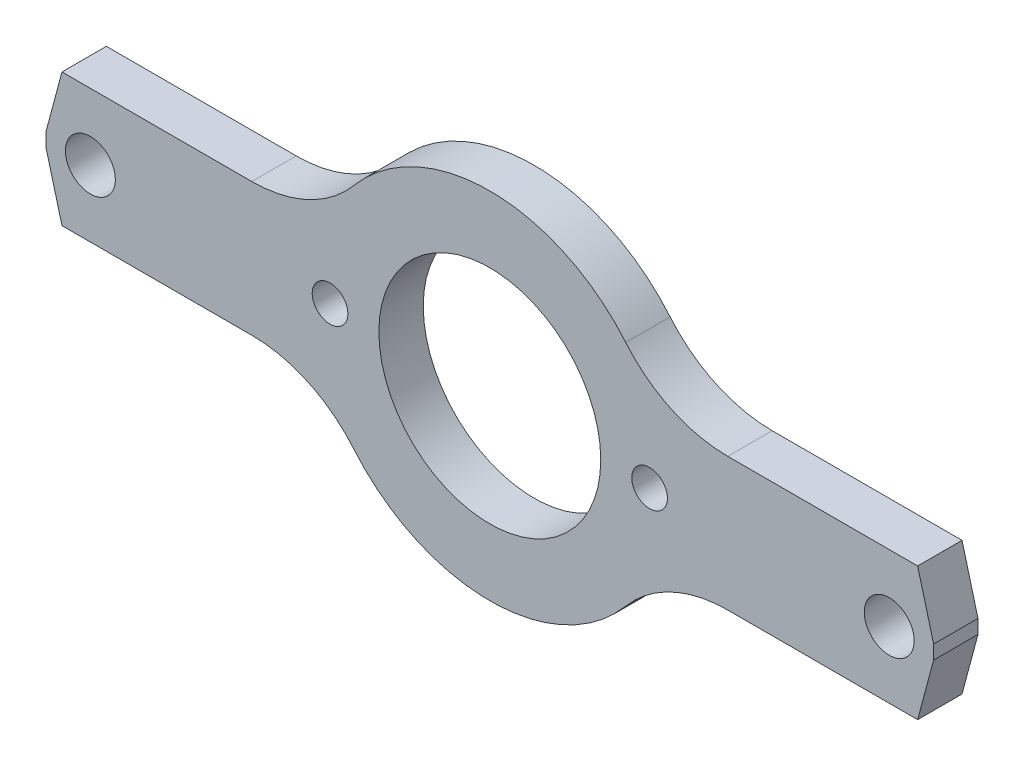
ISO-10303-21;
HEADER;
FILE_DESCRIPTION(('STEP AP214'),'2;1');
FILE_NAME('part.step','',(''),(''),'','','');
FILE_SCHEMA(('AUTOMOTIVE_DESIGN { 1 0 10303 214 1 1 1 1 }'));
ENDSEC;
DATA;
#1=APPLICATION_CONTEXT('core data for automotive mechanical design processes');
#2=APPLICATION_PROTOCOL_DEFINITION('international standard','automotive_design',2000,#1);
#3=PRODUCT_CONTEXT('',#1,'mechanical');
#4=PRODUCT('Part','Part','',(#3));
#5=PRODUCT_RELATED_PRODUCT_CATEGORY('part','',(#4));
#6=PRODUCT_DEFINITION_FORMATION('','',#4);
#7=PRODUCT_DEFINITION_CONTEXT('part definition',#1,'design');
#8=PRODUCT_DEFINITION('design','',#6,#7);
#9=PRODUCT_DEFINITION_SHAPE('','',#8);
#10=(LENGTH_UNIT() NAMED_UNIT(*) SI_UNIT(.MILLI.,.METRE.));
#11=(NAMED_UNIT(*) PLANE_ANGLE_UNIT() SI_UNIT($,.RADIAN.));
#12=(NAMED_UNIT(*) SI_UNIT($,.STERADIAN.) SOLID_ANGLE_UNIT());
#13=UNCERTAINTY_MEASURE_WITH_UNIT(LENGTH_MEASURE(1.E-05),#10,'distance_accuracy_value','');
#14=(GEOMETRIC_REPRESENTATION_CONTEXT(3) GLOBAL_UNCERTAINTY_ASSIGNED_CONTEXT((#13)) GLOBAL_UNIT_ASSIGNED_CONTEXT((#10,
#11,#12)) REPRESENTATION_CONTEXT('',''));
#15=CARTESIAN_POINT('',(0.,0.,0.));
#16=DIRECTION('',(0.,0.,1.));
#17=DIRECTION('',(1.,0.,0.));
#18=AXIS2_PLACEMENT_3D('',#15,#16,#17);
#19=CARTESIAN_POINT('',(63.5,-9.525,6.35));
#20=DIRECTION('',(0.,0.,-1.));
#21=DIRECTION('',(-1.,0.,0.));
#22=AXIS2_PLACEMENT_3D('',#19,#20,#21);
#23=PLANE('',#22);
#24=CARTESIAN_POINT('',(40.64,-9.525,6.35));
#25=DIRECTION('',(0.,0.,-1.));
#26=DIRECTION('',(-1.,0.,0.));
#27=AXIS2_PLACEMENT_3D('',#24,#25,#26);
#28=CIRCLE('',#27,2.5527);
#29=CARTESIAN_POINT('',(38.0873,-9.525,6.35));
#30=VERTEX_POINT('',#29);
#31=EDGE_CURVE('E402',#30,#30,#28,.T.);
#32=ORIENTED_EDGE('',*,*,#31,.T.);
#33=EDGE_LOOP('',(#32));
#34=FACE_BOUND('',#33,.T.);
#35=CARTESIAN_POINT('',(86.36,-9.525,6.35));
#36=DIRECTION('',(0.,0.,-1.));
#37=DIRECTION('',(-1.,0.,0.));
#38=AXIS2_PLACEMENT_3D('',#35,#36,#37);
#39=CIRCLE('',#38,2.55269999999999);
#40=CARTESIAN_POINT('',(83.8073,-9.525,6.35));
#41=VERTEX_POINT('',#40);
#42=EDGE_CURVE('E406',#41,#41,#39,.T.);
#43=ORIENTED_EDGE('',*,*,#42,.T.);
#44=EDGE_LOOP('',(#43));
#45=FACE_BOUND('',#44,.T.);
#46=CARTESIAN_POINT('',(6.35,-9.52499999999991,6.35));
#47=DIRECTION('',(0.,0.,1.));
#48=DIRECTION('',(1.,0.,0.));
#49=AXIS2_PLACEMENT_3D('',#46,#47,#48);
#50=CIRCLE('',#49,3.57123999999999);
#51=CARTESIAN_POINT('',(9.92123999999999,-9.52499999999991,6.35));
#52=VERTEX_POINT('',#51);
#53=EDGE_CURVE('E412',#52,#52,#50,.T.);
#54=ORIENTED_EDGE('',*,*,#53,.F.);
#55=EDGE_LOOP('',(#54));
#56=FACE_BOUND('',#55,.T.);
#57=CARTESIAN_POINT('',(120.65,-9.52499999999991,6.35));
#58=DIRECTION('',(0.,0.,1.));
#59=DIRECTION('',(1.,0.,0.));
#60=AXIS2_PLACEMENT_3D('',#57,#58,#59);
#61=CIRCLE('',#60,3.57123999999999);
#62=CARTESIAN_POINT('',(124.22124,-9.52499999999991,6.35));
#63=VERTEX_POINT('',#62);
#64=EDGE_CURVE('E418',#63,#63,#61,.T.);
#65=ORIENTED_EDGE('',*,*,#64,.F.);
#66=EDGE_LOOP('',(#65));
#67=FACE_BOUND('',#66,.T.);
#68=CARTESIAN_POINT('',(63.5,-9.525,6.35));
#69=DIRECTION('',(0.,0.,1.));
#70=DIRECTION('',(-1.,0.,0.));
#71=AXIS2_PLACEMENT_3D('',#68,#69,#70);
#72=CIRCLE('',#71,25.4);
#73=CARTESIAN_POINT('',(44.0439532509289,-25.8535714285714,6.35));
#74=VERTEX_POINT('',#73);
#75=CARTESIAN_POINT('',(82.9560467490711,-25.8535714285714,6.35));
#76=VERTEX_POINT('',#75);
#77=EDGE_CURVE('E267',#74,#76,#72,.T.);
#78=ORIENTED_EDGE('',*,*,#77,.T.);
#79=CARTESIAN_POINT('',(97.5480818108745,-38.1,6.35));
#80=DIRECTION('',(0.,0.,-1.));
#81=DIRECTION('',(-1.,0.,0.));
#82=AXIS2_PLACEMENT_3D('',#79,#80,#81);
#83=CIRCLE('',#82,19.05);
#84=CARTESIAN_POINT('',(97.5480818108745,-19.05,6.35));
#85=VERTEX_POINT('',#84);
#86=EDGE_CURVE('E236',#76,#85,#83,.T.);
#87=ORIENTED_EDGE('',*,*,#86,.T.);
#88=DIRECTION('',(1.,0.,0.));
#89=VECTOR('',#88,1.);
#90=CARTESIAN_POINT('',(127.,-19.05,6.35));
#91=LINE('',#90,#89);
#92=CARTESIAN_POINT('',(124.714,-19.05,6.35));
#93=VERTEX_POINT('',#92);
#94=EDGE_CURVE('E270',#85,#93,#91,.T.);
#95=ORIENTED_EDGE('',*,*,#94,.T.);
#96=DIRECTION('',(-0.258819045102523,-0.965925826289068,0.));
#97=VECTOR('',#96,1.);
#98=CARTESIAN_POINT('',(127.,-10.5185318538976,6.35));
#99=LINE('',#98,#97);
#100=CARTESIAN_POINT('',(127.,-10.5185318538976,6.35));
#101=VERTEX_POINT('',#100);
#102=EDGE_CURVE('E199',#93,#101,#99,.F.);
#103=ORIENTED_EDGE('',*,*,#102,.T.);
#104=DIRECTION('',(0.,1.,0.));
#105=VECTOR('',#104,1.);
#106=CARTESIAN_POINT('',(127.,0.,6.35));
#107=LINE('',#106,#105);
#108=CARTESIAN_POINT('',(127.,-8.53146814610239,6.35));
#109=VERTEX_POINT('',#108);
#110=EDGE_CURVE('E165',#101,#109,#107,.T.);
#111=ORIENTED_EDGE('',*,*,#110,.T.);
#112=DIRECTION('',(0.258819045102522,-0.965925826289068,0.));
#113=VECTOR('',#112,1.);
#114=CARTESIAN_POINT('',(124.714,0.,6.35));
#115=LINE('',#114,#113);
#116=CARTESIAN_POINT('',(124.714,0.,6.35));
#117=VERTEX_POINT('',#116);
#118=EDGE_CURVE('E197',#109,#117,#115,.F.);
#119=ORIENTED_EDGE('',*,*,#118,.T.);
#120=DIRECTION('',(-1.,0.,0.));
#121=VECTOR('',#120,1.);
#122=CARTESIAN_POINT('',(87.0464301965287,0.,6.35));
#123=LINE('',#122,#121);
#124=CARTESIAN_POINT('',(97.5480818108745,0.,6.35));
#125=VERTEX_POINT('',#124);
#126=EDGE_CURVE('E273',#117,#125,#123,.T.);
#127=ORIENTED_EDGE('',*,*,#126,.T.);
#128=CARTESIAN_POINT('',(97.5480818108745,19.05,6.35));
#129=DIRECTION('',(0.,0.,-1.));
#130=DIRECTION('',(-1.,0.,0.));
#131=AXIS2_PLACEMENT_3D('',#128,#129,#130);
#132=CIRCLE('',#131,19.05);
#133=CARTESIAN_POINT('',(82.9560467490711,6.80357142857144,6.35));
#134=VERTEX_POINT('',#133);
#135=EDGE_CURVE('E240',#125,#134,#132,.T.);
#136=ORIENTED_EDGE('',*,*,#135,.T.);
#137=CARTESIAN_POINT('',(63.5,-9.525,6.35));
#138=DIRECTION('',(0.,0.,1.));
#139=DIRECTION('',(-1.,0.,0.));
#140=AXIS2_PLACEMENT_3D('',#137,#138,#139);
#141=CIRCLE('',#140,25.4);
#142=CARTESIAN_POINT('',(44.0439532509289,6.80357142857144,6.35));
#143=VERTEX_POINT('',#142);
#144=EDGE_CURVE('E185',#134,#143,#141,.T.);
#145=ORIENTED_EDGE('',*,*,#144,.T.);
#146=CARTESIAN_POINT('',(29.4519181891255,19.05,6.35));
#147=DIRECTION('',(0.,0.,-1.));
#148=DIRECTION('',(-1.,0.,0.));
#149=AXIS2_PLACEMENT_3D('',#146,#147,#148);
#150=CIRCLE('',#149,19.05);
#151=CARTESIAN_POINT('',(29.4519181891255,0.,6.35));
#152=VERTEX_POINT('',#151);
#153=EDGE_CURVE('E11',#143,#152,#150,.T.);
#154=ORIENTED_EDGE('',*,*,#153,.T.);
#155=DIRECTION('',(-1.,0.,0.));
#156=VECTOR('',#155,1.);
#157=CARTESIAN_POINT('',(0.,0.,6.35));
#158=LINE('',#157,#156);
#159=CARTESIAN_POINT('',(2.286,0.,6.35));
#160=VERTEX_POINT('',#159);
#161=EDGE_CURVE('E184',#152,#160,#158,.T.);
#162=ORIENTED_EDGE('',*,*,#161,.T.);
#163=DIRECTION('',(0.258819045102522,0.965925826289068,0.));
#164=VECTOR('',#163,1.);
#165=CARTESIAN_POINT('',(0.,-8.53146814610239,6.35));
#166=LINE('',#165,#164);
#167=CARTESIAN_POINT('',(0.,-8.53146814610235,6.35));
#168=VERTEX_POINT('',#167);
#169=EDGE_CURVE('E193',#160,#168,#166,.F.);
#170=ORIENTED_EDGE('',*,*,#169,.T.);
#171=DIRECTION('',(0.,-1.,0.));
#172=VECTOR('',#171,1.);
#173=CARTESIAN_POINT('',(0.,0.,6.35));
#174=LINE('',#173,#172);
#175=CARTESIAN_POINT('',(0.,-10.5185318538975,6.35));
#176=VERTEX_POINT('',#175);
#177=EDGE_CURVE('E256',#168,#176,#174,.T.);
#178=ORIENTED_EDGE('',*,*,#177,.T.);
#179=DIRECTION('',(-0.258819045102523,0.965925826289068,0.));
#180=VECTOR('',#179,1.);
#181=CARTESIAN_POINT('',(2.286,-19.05,6.35));
#182=LINE('',#181,#180);
#183=CARTESIAN_POINT('',(2.286,-19.05,6.35));
#184=VERTEX_POINT('',#183);
#185=EDGE_CURVE('E195',#176,#184,#182,.F.);
#186=ORIENTED_EDGE('',*,*,#185,.T.);
#187=DIRECTION('',(1.,0.,0.));
#188=VECTOR('',#187,1.);
#189=CARTESIAN_POINT('',(0.,-19.05,6.35));
#190=LINE('',#189,#188);
#191=CARTESIAN_POINT('',(29.4519181891255,-19.05,6.35));
#192=VERTEX_POINT('',#191);
#193=EDGE_CURVE('E259',#184,#192,#190,.T.);
#194=ORIENTED_EDGE('',*,*,#193,.T.);
#195=CARTESIAN_POINT('',(29.4519181891255,-38.1,6.35));
#196=DIRECTION('',(0.,0.,-1.));
#197=DIRECTION('',(-1.,0.,0.));
#198=AXIS2_PLACEMENT_3D('',#195,#196,#197);
#199=CIRCLE('',#198,19.05);
#200=EDGE_CURVE('E244',#192,#74,#199,.T.);
#201=ORIENTED_EDGE('',*,*,#200,.T.);
#202=EDGE_LOOP('',(#78,#87,#95,#103,#111,#119,#127,#136,#145,#154,#162,#170,#178,#186,#194,#201));
#203=FACE_BOUND('',#202,.T.);
#204=CARTESIAN_POINT('',(63.5,-9.525,6.35));
#205=DIRECTION('',(0.,0.,1.));
#206=DIRECTION('',(1.,0.,0.));
#207=AXIS2_PLACEMENT_3D('',#204,#205,#206);
#208=CIRCLE('',#207,15.875);
#209=CARTESIAN_POINT('',(79.375,-9.525,6.35));
#210=VERTEX_POINT('',#209);
#211=EDGE_CURVE('E279',#210,#210,#208,.T.);
#212=ORIENTED_EDGE('',*,*,#211,.F.);
#213=EDGE_LOOP('',(#212));
#214=FACE_BOUND('',#213,.T.);
#215=ADVANCED_FACE('F33',(#34,#45,#56,#67,#203,#214),#23,.F.);
#216=CARTESIAN_POINT('',(63.5,-9.525,0.));
#217=DIRECTION('',(0.,0.,-1.));
#218=DIRECTION('',(-1.,0.,0.));
#219=AXIS2_PLACEMENT_3D('',#216,#217,#218);
#220=PLANE('',#219);
#221=CARTESIAN_POINT('',(40.64,-9.525,0.));
#222=DIRECTION('',(0.,0.,-1.));
#223=DIRECTION('',(-1.,0.,0.));
#224=AXIS2_PLACEMENT_3D('',#221,#222,#223);
#225=CIRCLE('',#224,2.5527);
#226=CARTESIAN_POINT('',(38.0873,-9.525,0.));
#227=VERTEX_POINT('',#226);
#228=EDGE_CURVE('E400',#227,#227,#225,.T.);
#229=ORIENTED_EDGE('',*,*,#228,.F.);
#230=EDGE_LOOP('',(#229));
#231=FACE_BOUND('',#230,.T.);
#232=CARTESIAN_POINT('',(86.36,-9.525,0.));
#233=DIRECTION('',(0.,0.,-1.));
#234=DIRECTION('',(-1.,0.,0.));
#235=AXIS2_PLACEMENT_3D('',#232,#233,#234);
#236=CIRCLE('',#235,2.55269999999999);
#237=CARTESIAN_POINT('',(83.8073,-9.525,0.));
#238=VERTEX_POINT('',#237);
#239=EDGE_CURVE('E403',#238,#238,#236,.T.);
#240=ORIENTED_EDGE('',*,*,#239,.F.);
#241=EDGE_LOOP('',(#240));
#242=FACE_BOUND('',#241,.T.);
#243=CARTESIAN_POINT('',(6.35,-9.52499999999991,0.));
#244=DIRECTION('',(0.,0.,1.));
#245=DIRECTION('',(1.,0.,0.));
#246=AXIS2_PLACEMENT_3D('',#243,#244,#245);
#247=CIRCLE('',#246,3.57124);
#248=CARTESIAN_POINT('',(9.92124,-9.52499999999991,0.));
#249=VERTEX_POINT('',#248);
#250=EDGE_CURVE('E415',#249,#249,#247,.T.);
#251=ORIENTED_EDGE('',*,*,#250,.T.);
#252=EDGE_LOOP('',(#251));
#253=FACE_BOUND('',#252,.T.);
#254=CARTESIAN_POINT('',(120.65,-9.52499999999991,0.));
#255=DIRECTION('',(0.,0.,1.));
#256=DIRECTION('',(1.,0.,0.));
#257=AXIS2_PLACEMENT_3D('',#254,#255,#256);
#258=CIRCLE('',#257,3.57124);
#259=CARTESIAN_POINT('',(124.22124,-9.52499999999991,0.));
#260=VERTEX_POINT('',#259);
#261=EDGE_CURVE('E421',#260,#260,#258,.T.);
#262=ORIENTED_EDGE('',*,*,#261,.T.);
#263=EDGE_LOOP('',(#262));
#264=FACE_BOUND('',#263,.T.);
#265=DIRECTION('',(0.,1.,0.));
#266=VECTOR('',#265,1.);
#267=CARTESIAN_POINT('',(127.,0.,0.));
#268=LINE('',#267,#266);
#269=CARTESIAN_POINT('',(127.,-10.5185318538976,0.));
#270=VERTEX_POINT('',#269);
#271=CARTESIAN_POINT('',(127.,-8.53146814610239,0.));
#272=VERTEX_POINT('',#271);
#273=EDGE_CURVE('E162',#270,#272,#268,.T.);
#274=ORIENTED_EDGE('',*,*,#273,.F.);
#275=DIRECTION('',(0.258819045102523,0.965925826289068,0.));
#276=VECTOR('',#275,1.);
#277=CARTESIAN_POINT('',(122.99468953363,-25.4665540144767,0.));
#278=LINE('',#277,#276);
#279=CARTESIAN_POINT('',(124.714,-19.05,0.));
#280=VERTEX_POINT('',#279);
#281=EDGE_CURVE('E146',#270,#280,#278,.F.);
#282=ORIENTED_EDGE('',*,*,#281,.T.);
#283=DIRECTION('',(1.,0.,0.));
#284=VECTOR('',#283,1.);
#285=CARTESIAN_POINT('',(127.,-19.05,0.));
#286=LINE('',#285,#284);
#287=CARTESIAN_POINT('',(97.5480818108745,-19.05,0.));
#288=VERTEX_POINT('',#287);
#289=EDGE_CURVE('E173',#288,#280,#286,.T.);
#290=ORIENTED_EDGE('',*,*,#289,.F.);
#291=CARTESIAN_POINT('',(97.5480818108745,-38.1,0.));
#292=DIRECTION('',(0.,0.,-1.));
#293=DIRECTION('',(-1.,0.,0.));
#294=AXIS2_PLACEMENT_3D('',#291,#292,#293);
#295=CIRCLE('',#294,19.05);
#296=CARTESIAN_POINT('',(82.9560467490711,-25.8535714285714,0.));
#297=VERTEX_POINT('',#296);
#298=EDGE_CURVE('E234',#288,#297,#295,.F.);
#299=ORIENTED_EDGE('',*,*,#298,.T.);
#300=CARTESIAN_POINT('',(63.5,-9.525,0.));
#301=DIRECTION('',(0.,0.,1.));
#302=DIRECTION('',(-1.,0.,0.));
#303=AXIS2_PLACEMENT_3D('',#300,#301,#302);
#304=CIRCLE('',#303,25.4);
#305=CARTESIAN_POINT('',(44.0439532509289,-25.8535714285714,0.));
#306=VERTEX_POINT('',#305);
#307=EDGE_CURVE('E178',#306,#297,#304,.T.);
#308=ORIENTED_EDGE('',*,*,#307,.F.);
#309=CARTESIAN_POINT('',(29.4519181891255,-38.1,0.));
#310=DIRECTION('',(0.,0.,-1.));
#311=DIRECTION('',(-1.,0.,0.));
#312=AXIS2_PLACEMENT_3D('',#309,#310,#311);
#313=CIRCLE('',#312,19.05);
#314=CARTESIAN_POINT('',(29.4519181891255,-19.05,0.));
#315=VERTEX_POINT('',#314);
#316=EDGE_CURVE('E242',#306,#315,#313,.F.);
#317=ORIENTED_EDGE('',*,*,#316,.T.);
#318=DIRECTION('',(1.,0.,0.));
#319=VECTOR('',#318,1.);
#320=CARTESIAN_POINT('',(0.,-19.05,0.));
#321=LINE('',#320,#319);
#322=CARTESIAN_POINT('',(2.286,-19.05,0.));
#323=VERTEX_POINT('',#322);
#324=EDGE_CURVE('E282',#323,#315,#321,.T.);
#325=ORIENTED_EDGE('',*,*,#324,.F.);
#326=DIRECTION('',(0.258819045102523,-0.965925826289068,0.));
#327=VECTOR('',#326,1.);
#328=CARTESIAN_POINT('',(4.00531046636974,-25.4665540144767,0.));
#329=LINE('',#328,#327);
#330=CARTESIAN_POINT('',(0.,-10.5185318538976,0.));
#331=VERTEX_POINT('',#330);
#332=EDGE_CURVE('E189',#323,#331,#329,.F.);
#333=ORIENTED_EDGE('',*,*,#332,.T.);
#334=DIRECTION('',(0.,-1.,0.));
#335=VECTOR('',#334,1.);
#336=CARTESIAN_POINT('',(0.,0.,0.));
#337=LINE('',#336,#335);
#338=CARTESIAN_POINT('',(0.,-8.5314681461024,0.));
#339=VERTEX_POINT('',#338);
#340=EDGE_CURVE('E278',#339,#331,#337,.T.);
#341=ORIENTED_EDGE('',*,*,#340,.F.);
#342=DIRECTION('',(-0.258819045102522,-0.965925826289068,0.));
#343=VECTOR('',#342,1.);
#344=CARTESIAN_POINT('',(4.00531046636971,6.41655401447669,0.));
#345=LINE('',#344,#343);
#346=CARTESIAN_POINT('',(2.286,0.,0.));
#347=VERTEX_POINT('',#346);
#348=EDGE_CURVE('E166',#339,#347,#345,.F.);
#349=ORIENTED_EDGE('',*,*,#348,.T.);
#350=DIRECTION('',(-1.,0.,0.));
#351=VECTOR('',#350,1.);
#352=CARTESIAN_POINT('',(0.,0.,0.));
#353=LINE('',#352,#351);
#354=CARTESIAN_POINT('',(29.4519181891255,0.,0.));
#355=VERTEX_POINT('',#354);
#356=EDGE_CURVE('E247',#355,#347,#353,.T.);
#357=ORIENTED_EDGE('',*,*,#356,.F.);
#358=CARTESIAN_POINT('',(29.4519181891255,19.05,0.));
#359=DIRECTION('',(0.,0.,-1.));
#360=DIRECTION('',(-1.,0.,0.));
#361=AXIS2_PLACEMENT_3D('',#358,#359,#360);
#362=CIRCLE('',#361,19.05);
#363=CARTESIAN_POINT('',(44.0439532509289,6.80357142857144,0.));
#364=VERTEX_POINT('',#363);
#365=EDGE_CURVE('E41',#355,#364,#362,.F.);
#366=ORIENTED_EDGE('',*,*,#365,.T.);
#367=CARTESIAN_POINT('',(63.5,-9.525,0.));
#368=DIRECTION('',(0.,0.,1.));
#369=DIRECTION('',(-1.,0.,0.));
#370=AXIS2_PLACEMENT_3D('',#367,#368,#369);
#371=CIRCLE('',#370,25.4);
#372=CARTESIAN_POINT('',(82.9560467490711,6.80357142857144,0.));
#373=VERTEX_POINT('',#372);
#374=EDGE_CURVE('E176',#373,#364,#371,.T.);
#375=ORIENTED_EDGE('',*,*,#374,.F.);
#376=CARTESIAN_POINT('',(97.5480818108745,19.05,0.));
#377=DIRECTION('',(0.,0.,-1.));
#378=DIRECTION('',(-1.,0.,0.));
#379=AXIS2_PLACEMENT_3D('',#376,#377,#378);
#380=CIRCLE('',#379,19.05);
#381=CARTESIAN_POINT('',(97.5480818108745,0.,0.));
#382=VERTEX_POINT('',#381);
#383=EDGE_CURVE('E238',#373,#382,#380,.F.);
#384=ORIENTED_EDGE('',*,*,#383,.T.);
#385=DIRECTION('',(-1.,0.,0.));
#386=VECTOR('',#385,1.);
#387=CARTESIAN_POINT('',(87.0464301965287,0.,0.));
#388=LINE('',#387,#386);
#389=CARTESIAN_POINT('',(124.714,0.,0.));
#390=VERTEX_POINT('',#389);
#391=EDGE_CURVE('E172',#390,#382,#388,.T.);
#392=ORIENTED_EDGE('',*,*,#391,.F.);
#393=DIRECTION('',(-0.258819045102522,0.965925826289068,0.));
#394=VECTOR('',#393,1.);
#395=CARTESIAN_POINT('',(122.99468953363,6.41655401447669,0.));
#396=LINE('',#395,#394);
#397=EDGE_CURVE('E156',#390,#272,#396,.F.);
#398=ORIENTED_EDGE('',*,*,#397,.T.);
#399=EDGE_LOOP('',(#274,#282,#290,#299,#308,#317,#325,#333,#341,#349,#357,#366,#375,#384,#392,#398));
#400=FACE_BOUND('',#399,.T.);
#401=CARTESIAN_POINT('',(63.5,-9.525,0.));
#402=DIRECTION('',(0.,0.,1.));
#403=DIRECTION('',(1.,0.,0.));
#404=AXIS2_PLACEMENT_3D('',#401,#402,#403);
#405=CIRCLE('',#404,15.875);
#406=CARTESIAN_POINT('',(79.375,-9.525,0.));
#407=VERTEX_POINT('',#406);
#408=EDGE_CURVE('E262',#407,#407,#405,.T.);
#409=ORIENTED_EDGE('',*,*,#408,.T.);
#410=EDGE_LOOP('',(#409));
#411=FACE_BOUND('',#410,.T.);
#412=ADVANCED_FACE('F169',(#231,#242,#253,#264,#400,#411),#220,.T.);
#413=CARTESIAN_POINT('',(0.,0.,6.35));
#414=DIRECTION('',(0.,-1.,0.));
#415=DIRECTION('',(0.,0.,-1.));
#416=AXIS2_PLACEMENT_3D('',#413,#414,#415);
#417=PLANE('',#416);
#418=ORIENTED_EDGE('',*,*,#161,.F.);
#419=DIRECTION('',(0.,0.,1.));
#420=VECTOR('',#419,1.);
#421=CARTESIAN_POINT('',(29.4519181891255,0.,0.));
#422=LINE('',#421,#420);
#423=EDGE_CURVE('E232',#152,#355,#422,.F.);
#424=ORIENTED_EDGE('',*,*,#423,.T.);
#425=ORIENTED_EDGE('',*,*,#356,.T.);
#426=DIRECTION('',(0.,0.,1.));
#427=VECTOR('',#426,1.);
#428=CARTESIAN_POINT('',(2.286,0.,6.35));
#429=LINE('',#428,#427);
#430=EDGE_CURVE('E212',#347,#160,#429,.T.);
#431=ORIENTED_EDGE('',*,*,#430,.T.);
#432=EDGE_LOOP('',(#418,#424,#425,#431));
#433=FACE_BOUND('',#432,.T.);
#434=ADVANCED_FACE('F253',(#433),#417,.F.);
#435=CARTESIAN_POINT('',(0.,0.,6.35));
#436=DIRECTION('',(1.,0.,0.));
#437=DIRECTION('',(0.,1.,0.));
#438=AXIS2_PLACEMENT_3D('',#435,#436,#437);
#439=PLANE('',#438);
#440=ORIENTED_EDGE('',*,*,#340,.T.);
#441=DIRECTION('',(0.,0.,1.));
#442=VECTOR('',#441,1.);
#443=CARTESIAN_POINT('',(0.,-10.5185318538976,6.35));
#444=LINE('',#443,#442);
#445=EDGE_CURVE('E210',#331,#176,#444,.T.);
#446=ORIENTED_EDGE('',*,*,#445,.T.);
#447=ORIENTED_EDGE('',*,*,#177,.F.);
#448=DIRECTION('',(0.,0.,-1.));
#449=VECTOR('',#448,1.);
#450=CARTESIAN_POINT('',(0.,-8.53146814610239,6.35));
#451=LINE('',#450,#449);
#452=EDGE_CURVE('E207',#168,#339,#451,.T.);
#453=ORIENTED_EDGE('',*,*,#452,.T.);
#454=EDGE_LOOP('',(#440,#446,#447,#453));
#455=FACE_BOUND('',#454,.T.);
#456=ADVANCED_FACE('F347',(#455),#439,.F.);
#457=CARTESIAN_POINT('',(0.,-19.05,6.35));
#458=DIRECTION('',(0.,1.,0.));
#459=DIRECTION('',(-1.,0.,0.));
#460=AXIS2_PLACEMENT_3D('',#457,#458,#459);
#461=PLANE('',#460);
#462=ORIENTED_EDGE('',*,*,#324,.T.);
#463=DIRECTION('',(0.,0.,1.));
#464=VECTOR('',#463,1.);
#465=CARTESIAN_POINT('',(29.4519181891255,-19.05,6.35));
#466=LINE('',#465,#464);
#467=EDGE_CURVE('E230',#315,#192,#466,.T.);
#468=ORIENTED_EDGE('',*,*,#467,.T.);
#469=ORIENTED_EDGE('',*,*,#193,.F.);
#470=DIRECTION('',(0.,0.,-1.));
#471=VECTOR('',#470,1.);
#472=CARTESIAN_POINT('',(2.286,-19.05,6.35));
#473=LINE('',#472,#471);
#474=EDGE_CURVE('E204',#184,#323,#473,.T.);
#475=ORIENTED_EDGE('',*,*,#474,.T.);
#476=EDGE_LOOP('',(#462,#468,#469,#475));
#477=FACE_BOUND('',#476,.T.);
#478=ADVANCED_FACE('F344',(#477),#461,.F.);
#479=CARTESIAN_POINT('',(63.5,-9.525,6.35));
#480=DIRECTION('',(0.,0.,-1.));
#481=DIRECTION('',(-1.,0.,0.));
#482=AXIS2_PLACEMENT_3D('',#479,#480,#481);
#483=CYLINDRICAL_SURFACE('',#482,25.4);
#484=ORIENTED_EDGE('',*,*,#307,.T.);
#485=DIRECTION('',(0.,0.,-1.));
#486=VECTOR('',#485,1.);
#487=CARTESIAN_POINT('',(82.9560467490711,-25.8535714285714,6.35));
#488=LINE('',#487,#486);
#489=EDGE_CURVE('E221',#297,#76,#488,.F.);
#490=ORIENTED_EDGE('',*,*,#489,.T.);
#491=ORIENTED_EDGE('',*,*,#77,.F.);
#492=DIRECTION('',(0.,0.,-1.));
#493=VECTOR('',#492,1.);
#494=CARTESIAN_POINT('',(44.0439532509289,-25.8535714285714,6.35));
#495=LINE('',#494,#493);
#496=EDGE_CURVE('E218',#74,#306,#495,.T.);
#497=ORIENTED_EDGE('',*,*,#496,.T.);
#498=EDGE_LOOP('',(#484,#490,#491,#497));
#499=FACE_BOUND('',#498,.T.);
#500=ADVANCED_FACE('F288',(#499),#483,.T.);
#501=CARTESIAN_POINT('',(127.,-19.05,6.35));
#502=DIRECTION('',(0.,1.,0.));
#503=DIRECTION('',(-1.,0.,0.));
#504=AXIS2_PLACEMENT_3D('',#501,#502,#503);
#505=PLANE('',#504);
#506=ORIENTED_EDGE('',*,*,#94,.F.);
#507=DIRECTION('',(0.,0.,1.));
#508=VECTOR('',#507,1.);
#509=CARTESIAN_POINT('',(97.5480818108745,-19.05,0.));
#510=LINE('',#509,#508);
#511=EDGE_CURVE('E215',#85,#288,#510,.F.);
#512=ORIENTED_EDGE('',*,*,#511,.T.);
#513=ORIENTED_EDGE('',*,*,#289,.T.);
#514=DIRECTION('',(0.,0.,1.));
#515=VECTOR('',#514,1.);
#516=CARTESIAN_POINT('',(124.714,-19.05,6.35));
#517=LINE('',#516,#515);
#518=EDGE_CURVE('E152',#280,#93,#517,.T.);
#519=ORIENTED_EDGE('',*,*,#518,.T.);
#520=EDGE_LOOP('',(#506,#512,#513,#519));
#521=FACE_BOUND('',#520,.T.);
#522=ADVANCED_FACE('F298',(#521),#505,.F.);
#523=CARTESIAN_POINT('',(127.,0.,6.35));
#524=DIRECTION('',(-1.,0.,0.));
#525=DIRECTION('',(0.,0.,1.));
#526=AXIS2_PLACEMENT_3D('',#523,#524,#525);
#527=PLANE('',#526);
#528=ORIENTED_EDGE('',*,*,#110,.F.);
#529=DIRECTION('',(0.,0.,-1.));
#530=VECTOR('',#529,1.);
#531=CARTESIAN_POINT('',(127.,-10.5185318538976,6.35));
#532=LINE('',#531,#530);
#533=EDGE_CURVE('E150',#101,#270,#532,.T.);
#534=ORIENTED_EDGE('',*,*,#533,.T.);
#535=ORIENTED_EDGE('',*,*,#273,.T.);
#536=DIRECTION('',(0.,0.,1.));
#537=VECTOR('',#536,1.);
#538=CARTESIAN_POINT('',(127.,-8.53146814610239,6.35));
#539=LINE('',#538,#537);
#540=EDGE_CURVE('E167',#272,#109,#539,.T.);
#541=ORIENTED_EDGE('',*,*,#540,.T.);
#542=EDGE_LOOP('',(#528,#534,#535,#541));
#543=FACE_BOUND('',#542,.T.);
#544=ADVANCED_FACE('F161',(#543),#527,.F.);
#545=CARTESIAN_POINT('',(87.0464301965287,0.,6.35));
#546=DIRECTION('',(0.,-1.,0.));
#547=DIRECTION('',(1.,0.,0.));
#548=AXIS2_PLACEMENT_3D('',#545,#546,#547);
#549=PLANE('',#548);
#550=ORIENTED_EDGE('',*,*,#391,.T.);
#551=DIRECTION('',(0.,0.,1.));
#552=VECTOR('',#551,1.);
#553=CARTESIAN_POINT('',(97.5480818108745,0.,6.35));
#554=LINE('',#553,#552);
#555=EDGE_CURVE('E228',#382,#125,#554,.T.);
#556=ORIENTED_EDGE('',*,*,#555,.T.);
#557=ORIENTED_EDGE('',*,*,#126,.F.);
#558=DIRECTION('',(0.,0.,-1.));
#559=VECTOR('',#558,1.);
#560=CARTESIAN_POINT('',(124.714,0.,6.35));
#561=LINE('',#560,#559);
#562=EDGE_CURVE('E201',#117,#390,#561,.T.);
#563=ORIENTED_EDGE('',*,*,#562,.T.);
#564=EDGE_LOOP('',(#550,#556,#557,#563));
#565=FACE_BOUND('',#564,.T.);
#566=ADVANCED_FACE('F305',(#565),#549,.F.);
#567=CARTESIAN_POINT('',(63.5,-9.525,6.35));
#568=DIRECTION('',(0.,0.,-1.));
#569=DIRECTION('',(-1.,0.,0.));
#570=AXIS2_PLACEMENT_3D('',#567,#568,#569);
#571=CYLINDRICAL_SURFACE('',#570,25.4);
#572=ORIENTED_EDGE('',*,*,#144,.F.);
#573=DIRECTION('',(0.,0.,-1.));
#574=VECTOR('',#573,1.);
#575=CARTESIAN_POINT('',(82.9560467490711,6.80357142857144,6.35));
#576=LINE('',#575,#574);
#577=EDGE_CURVE('E225',#134,#373,#576,.T.);
#578=ORIENTED_EDGE('',*,*,#577,.T.);
#579=ORIENTED_EDGE('',*,*,#374,.T.);
#580=DIRECTION('',(0.,0.,-1.));
#581=VECTOR('',#580,1.);
#582=CARTESIAN_POINT('',(44.0439532509289,6.80357142857144,6.35));
#583=LINE('',#582,#581);
#584=EDGE_CURVE('E223',#364,#143,#583,.F.);
#585=ORIENTED_EDGE('',*,*,#584,.T.);
#586=EDGE_LOOP('',(#572,#578,#579,#585));
#587=FACE_BOUND('',#586,.T.);
#588=ADVANCED_FACE('F250',(#587),#571,.T.);
#589=CARTESIAN_POINT('',(63.5,-9.525,6.35));
#590=DIRECTION('',(0.,0.,-1.));
#591=DIRECTION('',(-1.,0.,0.));
#592=AXIS2_PLACEMENT_3D('',#589,#590,#591);
#593=CYLINDRICAL_SURFACE('',#592,15.875);
#594=ORIENTED_EDGE('',*,*,#211,.T.);
#595=EDGE_LOOP('',(#594));
#596=FACE_BOUND('',#595,.T.);
#597=ORIENTED_EDGE('',*,*,#408,.F.);
#598=EDGE_LOOP('',(#597));
#599=FACE_BOUND('',#598,.T.);
#600=ADVANCED_FACE('F331',(#596,#599),#593,.F.);
#601=CARTESIAN_POINT('',(127.,-10.5185318538976,6.35));
#602=DIRECTION('',(-0.965925826289068,0.258819045102523,0.));
#603=DIRECTION('',(-0.258819045102523,-0.965925826289068,0.));
#604=AXIS2_PLACEMENT_3D('',#601,#602,#603);
#605=PLANE('',#604);
#606=ORIENTED_EDGE('',*,*,#102,.F.);
#607=ORIENTED_EDGE('',*,*,#518,.F.);
#608=ORIENTED_EDGE('',*,*,#281,.F.);
#609=ORIENTED_EDGE('',*,*,#533,.F.);
#610=EDGE_LOOP('',(#606,#607,#608,#609));
#611=FACE_BOUND('',#610,.T.);
#612=ADVANCED_FACE('F149',(#611),#605,.F.);
#613=CARTESIAN_POINT('',(124.714,0.,6.35));
#614=DIRECTION('',(-0.965925826289068,-0.258819045102522,0.));
#615=DIRECTION('',(0.258819045102522,-0.965925826289068,0.));
#616=AXIS2_PLACEMENT_3D('',#613,#614,#615);
#617=PLANE('',#616);
#618=ORIENTED_EDGE('',*,*,#118,.F.);
#619=ORIENTED_EDGE('',*,*,#540,.F.);
#620=ORIENTED_EDGE('',*,*,#397,.F.);
#621=ORIENTED_EDGE('',*,*,#562,.F.);
#622=EDGE_LOOP('',(#618,#619,#620,#621));
#623=FACE_BOUND('',#622,.T.);
#624=ADVANCED_FACE('F303',(#623),#617,.F.);
#625=CARTESIAN_POINT('',(2.286,-19.05,6.35));
#626=DIRECTION('',(0.965925826289068,0.258819045102523,0.));
#627=DIRECTION('',(-0.258819045102523,0.965925826289068,0.));
#628=AXIS2_PLACEMENT_3D('',#625,#626,#627);
#629=PLANE('',#628);
#630=ORIENTED_EDGE('',*,*,#185,.F.);
#631=ORIENTED_EDGE('',*,*,#445,.F.);
#632=ORIENTED_EDGE('',*,*,#332,.F.);
#633=ORIENTED_EDGE('',*,*,#474,.F.);
#634=EDGE_LOOP('',(#630,#631,#632,#633));
#635=FACE_BOUND('',#634,.T.);
#636=ADVANCED_FACE('F358',(#635),#629,.F.);
#637=CARTESIAN_POINT('',(0.,-8.53146814610239,6.35));
#638=DIRECTION('',(0.965925826289068,-0.258819045102522,0.));
#639=DIRECTION('',(0.258819045102522,0.965925826289068,0.));
#640=AXIS2_PLACEMENT_3D('',#637,#638,#639);
#641=PLANE('',#640);
#642=ORIENTED_EDGE('',*,*,#169,.F.);
#643=ORIENTED_EDGE('',*,*,#430,.F.);
#644=ORIENTED_EDGE('',*,*,#348,.F.);
#645=ORIENTED_EDGE('',*,*,#452,.F.);
#646=EDGE_LOOP('',(#642,#643,#644,#645));
#647=FACE_BOUND('',#646,.T.);
#648=ADVANCED_FACE('F361',(#647),#641,.F.);
#649=CARTESIAN_POINT('',(120.65,-9.52499999999991,6.35));
#650=DIRECTION('',(0.,0.,1.));
#651=DIRECTION('',(1.,0.,0.));
#652=AXIS2_PLACEMENT_3D('',#649,#650,#651);
#653=CYLINDRICAL_SURFACE('',#652,3.57124);
#654=ORIENTED_EDGE('',*,*,#261,.F.);
#655=EDGE_LOOP('',(#654));
#656=FACE_BOUND('',#655,.T.);
#657=ORIENTED_EDGE('',*,*,#64,.T.);
#658=EDGE_LOOP('',(#657));
#659=FACE_BOUND('',#658,.T.);
#660=ADVANCED_FACE('F364',(#656,#659),#653,.F.);
#661=CARTESIAN_POINT('',(6.35,-9.52499999999991,6.35));
#662=DIRECTION('',(0.,0.,1.));
#663=DIRECTION('',(1.,0.,0.));
#664=AXIS2_PLACEMENT_3D('',#661,#662,#663);
#665=CYLINDRICAL_SURFACE('',#664,3.57123999999999);
#666=ORIENTED_EDGE('',*,*,#250,.F.);
#667=EDGE_LOOP('',(#666));
#668=FACE_BOUND('',#667,.T.);
#669=ORIENTED_EDGE('',*,*,#53,.T.);
#670=EDGE_LOOP('',(#669));
#671=FACE_BOUND('',#670,.T.);
#672=ADVANCED_FACE('F369',(#668,#671),#665,.F.);
#673=CARTESIAN_POINT('',(86.36,-9.525,0.));
#674=DIRECTION('',(0.,0.,-1.));
#675=DIRECTION('',(-1.,0.,0.));
#676=AXIS2_PLACEMENT_3D('',#673,#674,#675);
#677=CYLINDRICAL_SURFACE('',#676,2.55269999999999);
#678=ORIENTED_EDGE('',*,*,#239,.T.);
#679=EDGE_LOOP('',(#678));
#680=FACE_BOUND('',#679,.T.);
#681=ORIENTED_EDGE('',*,*,#42,.F.);
#682=EDGE_LOOP('',(#681));
#683=FACE_BOUND('',#682,.T.);
#684=ADVANCED_FACE('F384',(#680,#683),#677,.F.);
#685=CARTESIAN_POINT('',(40.64,-9.525,0.));
#686=DIRECTION('',(0.,0.,-1.));
#687=DIRECTION('',(-1.,0.,0.));
#688=AXIS2_PLACEMENT_3D('',#685,#686,#687);
#689=CYLINDRICAL_SURFACE('',#688,2.5527);
#690=ORIENTED_EDGE('',*,*,#228,.T.);
#691=EDGE_LOOP('',(#690));
#692=FACE_BOUND('',#691,.T.);
#693=ORIENTED_EDGE('',*,*,#31,.F.);
#694=EDGE_LOOP('',(#693));
#695=FACE_BOUND('',#694,.T.);
#696=ADVANCED_FACE('F318',(#692,#695),#689,.F.);
#697=CARTESIAN_POINT('',(97.5480818108745,-38.1,6.35));
#698=DIRECTION('',(0.,0.,-1.));
#699=DIRECTION('',(-1.,0.,0.));
#700=AXIS2_PLACEMENT_3D('',#697,#698,#699);
#701=CYLINDRICAL_SURFACE('',#700,19.05);
#702=ORIENTED_EDGE('',*,*,#86,.F.);
#703=ORIENTED_EDGE('',*,*,#489,.F.);
#704=ORIENTED_EDGE('',*,*,#298,.F.);
#705=ORIENTED_EDGE('',*,*,#511,.F.);
#706=EDGE_LOOP('',(#702,#703,#704,#705));
#707=FACE_BOUND('',#706,.T.);
#708=ADVANCED_FACE('F293',(#707),#701,.F.);
#709=CARTESIAN_POINT('',(97.5480818108745,19.05,6.35));
#710=DIRECTION('',(0.,0.,-1.));
#711=DIRECTION('',(-1.,0.,0.));
#712=AXIS2_PLACEMENT_3D('',#709,#710,#711);
#713=CYLINDRICAL_SURFACE('',#712,19.05);
#714=ORIENTED_EDGE('',*,*,#135,.F.);
#715=ORIENTED_EDGE('',*,*,#555,.F.);
#716=ORIENTED_EDGE('',*,*,#383,.F.);
#717=ORIENTED_EDGE('',*,*,#577,.F.);
#718=EDGE_LOOP('',(#714,#715,#716,#717));
#719=FACE_BOUND('',#718,.T.);
#720=ADVANCED_FACE('F309',(#719),#713,.F.);
#721=CARTESIAN_POINT('',(29.4519181891255,-38.1,6.35));
#722=DIRECTION('',(0.,0.,-1.));
#723=DIRECTION('',(-1.,0.,0.));
#724=AXIS2_PLACEMENT_3D('',#721,#722,#723);
#725=CYLINDRICAL_SURFACE('',#724,19.05);
#726=ORIENTED_EDGE('',*,*,#200,.F.);
#727=ORIENTED_EDGE('',*,*,#467,.F.);
#728=ORIENTED_EDGE('',*,*,#316,.F.);
#729=ORIENTED_EDGE('',*,*,#496,.F.);
#730=EDGE_LOOP('',(#726,#727,#728,#729));
#731=FACE_BOUND('',#730,.T.);
#732=ADVANCED_FACE('F311',(#731),#725,.F.);
#733=CARTESIAN_POINT('',(29.4519181891255,19.05,6.35));
#734=DIRECTION('',(0.,0.,-1.));
#735=DIRECTION('',(-1.,0.,0.));
#736=AXIS2_PLACEMENT_3D('',#733,#734,#735);
#737=CYLINDRICAL_SURFACE('',#736,19.05);
#738=ORIENTED_EDGE('',*,*,#153,.F.);
#739=ORIENTED_EDGE('',*,*,#584,.F.);
#740=ORIENTED_EDGE('',*,*,#365,.F.);
#741=ORIENTED_EDGE('',*,*,#423,.F.);
#742=EDGE_LOOP('',(#738,#739,#740,#741));
#743=FACE_BOUND('',#742,.T.);
#744=ADVANCED_FACE('F35',(#743),#737,.F.);
#745=CLOSED_SHELL('',(#215,#412,#434,#456,#478,#500,#522,#544,#566,#588,#600,#612,#624,#636,
#648,#660,#672,#684,#696,#708,#720,#732,#744));
#746=MANIFOLD_SOLID_BREP('B2',#745);
#747=ADVANCED_BREP_SHAPE_REPRESENTATION('',(#18,#746),#14);
#748=SHAPE_DEFINITION_REPRESENTATION(#9,#747);
ENDSEC;
END-ISO-10303-21;
